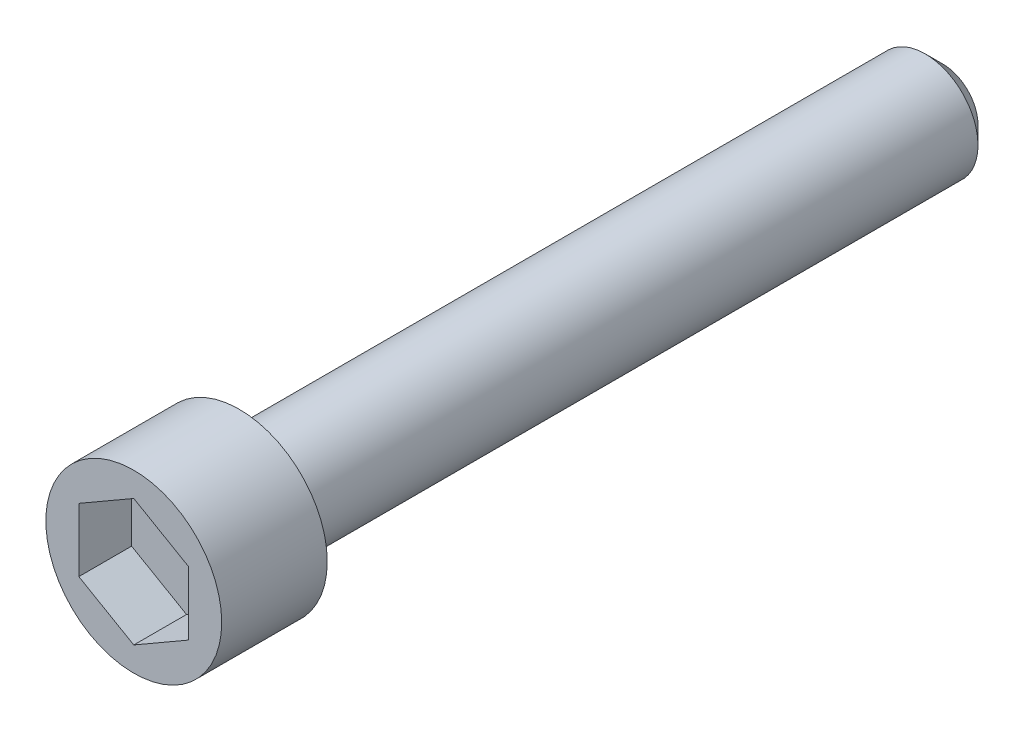
ISO-10303-21;
HEADER;
FILE_DESCRIPTION(('STEP AP214'),'2;1');
FILE_NAME('part.step','',(''),(''),'','','');
FILE_SCHEMA(('AUTOMOTIVE_DESIGN { 1 0 10303 214 1 1 1 1 }'));
ENDSEC;
DATA;
#1=APPLICATION_CONTEXT('core data for automotive mechanical design processes');
#2=APPLICATION_PROTOCOL_DEFINITION('international standard','automotive_design',2000,#1);
#3=PRODUCT_CONTEXT('',#1,'mechanical');
#4=PRODUCT('Part','Part','',(#3));
#5=PRODUCT_RELATED_PRODUCT_CATEGORY('part','',(#4));
#6=PRODUCT_DEFINITION_FORMATION('','',#4);
#7=PRODUCT_DEFINITION_CONTEXT('part definition',#1,'design');
#8=PRODUCT_DEFINITION('design','',#6,#7);
#9=PRODUCT_DEFINITION_SHAPE('','',#8);
#10=(LENGTH_UNIT() NAMED_UNIT(*) SI_UNIT(.MILLI.,.METRE.));
#11=(NAMED_UNIT(*) PLANE_ANGLE_UNIT() SI_UNIT($,.RADIAN.));
#12=(NAMED_UNIT(*) SI_UNIT($,.STERADIAN.) SOLID_ANGLE_UNIT());
#13=UNCERTAINTY_MEASURE_WITH_UNIT(LENGTH_MEASURE(1.E-05),#10,'distance_accuracy_value','');
#14=(GEOMETRIC_REPRESENTATION_CONTEXT(3) GLOBAL_UNCERTAINTY_ASSIGNED_CONTEXT((#13)) GLOBAL_UNIT_ASSIGNED_CONTEXT((#10,
#11,#12)) REPRESENTATION_CONTEXT('',''));
#15=CARTESIAN_POINT('',(0.,0.,0.));
#16=DIRECTION('',(0.,0.,1.));
#17=DIRECTION('',(1.,0.,0.));
#18=AXIS2_PLACEMENT_3D('',#15,#16,#17);
#19=CARTESIAN_POINT('',(0.,0.,20.));
#20=DIRECTION('',(0.,0.,-1.));
#21=DIRECTION('',(-1.,0.,0.));
#22=AXIS2_PLACEMENT_3D('',#19,#20,#21);
#23=CYLINDRICAL_SURFACE('',#22,1.5);
#24=CARTESIAN_POINT('',(0.,0.,0.500000000000004));
#25=DIRECTION('',(0.,0.,1.));
#26=DIRECTION('',(1.,0.,0.));
#27=AXIS2_PLACEMENT_3D('',#24,#25,#26);
#28=CIRCLE('',#27,1.5);
#29=CARTESIAN_POINT('',(1.5,0.,0.500000000000004));
#30=VERTEX_POINT('',#29);
#31=EDGE_CURVE('E44',#30,#30,#28,.T.);
#32=ORIENTED_EDGE('',*,*,#31,.T.);
#33=EDGE_LOOP('',(#32));
#34=FACE_BOUND('',#33,.T.);
#35=CARTESIAN_POINT('',(0.,0.,20.));
#36=DIRECTION('',(0.,0.,1.));
#37=DIRECTION('',(1.,0.,0.));
#38=AXIS2_PLACEMENT_3D('',#35,#36,#37);
#39=CIRCLE('',#38,1.5);
#40=CARTESIAN_POINT('',(1.5,0.,20.));
#41=VERTEX_POINT('',#40);
#42=EDGE_CURVE('E147',#41,#41,#39,.T.);
#43=ORIENTED_EDGE('',*,*,#42,.F.);
#44=EDGE_LOOP('',(#43));
#45=FACE_BOUND('',#44,.T.);
#46=ADVANCED_FACE('F36',(#34,#45),#23,.T.);
#47=CARTESIAN_POINT('',(0.,0.,0.));
#48=DIRECTION('',(0.,0.,1.));
#49=DIRECTION('',(1.,0.,0.));
#50=AXIS2_PLACEMENT_3D('',#47,#48,#49);
#51=PLANE('',#50);
#52=CARTESIAN_POINT('',(0.,0.,0.));
#53=DIRECTION('',(0.,0.,1.));
#54=DIRECTION('',(1.,0.,0.));
#55=AXIS2_PLACEMENT_3D('',#52,#53,#54);
#56=CIRCLE('',#55,0.999999999999997);
#57=CARTESIAN_POINT('',(0.999999999999997,0.,0.));
#58=VERTEX_POINT('',#57);
#59=EDGE_CURVE('E11',#58,#58,#56,.F.);
#60=ORIENTED_EDGE('',*,*,#59,.T.);
#61=EDGE_LOOP('',(#60));
#62=FACE_BOUND('',#61,.T.);
#63=ADVANCED_FACE('F165',(#62),#51,.F.);
#64=CARTESIAN_POINT('',(0.,0.,23.));
#65=DIRECTION('',(0.,0.,-1.));
#66=DIRECTION('',(-1.,0.,0.));
#67=AXIS2_PLACEMENT_3D('',#64,#65,#66);
#68=CYLINDRICAL_SURFACE('',#67,2.5);
#69=CARTESIAN_POINT('',(0.,0.,23.));
#70=DIRECTION('',(0.,0.,1.));
#71=DIRECTION('',(1.,0.,0.));
#72=AXIS2_PLACEMENT_3D('',#69,#70,#71);
#73=CIRCLE('',#72,2.5);
#74=CARTESIAN_POINT('',(2.5,0.,23.));
#75=VERTEX_POINT('',#74);
#76=EDGE_CURVE('E144',#75,#75,#73,.T.);
#77=ORIENTED_EDGE('',*,*,#76,.F.);
#78=EDGE_LOOP('',(#77));
#79=FACE_BOUND('',#78,.T.);
#80=CARTESIAN_POINT('',(0.,0.,20.));
#81=DIRECTION('',(0.,0.,1.));
#82=DIRECTION('',(1.,0.,0.));
#83=AXIS2_PLACEMENT_3D('',#80,#81,#82);
#84=CIRCLE('',#83,2.5);
#85=CARTESIAN_POINT('',(2.5,0.,20.));
#86=VERTEX_POINT('',#85);
#87=EDGE_CURVE('E138',#86,#86,#84,.T.);
#88=ORIENTED_EDGE('',*,*,#87,.T.);
#89=EDGE_LOOP('',(#88));
#90=FACE_BOUND('',#89,.T.);
#91=ADVANCED_FACE('F169',(#79,#90),#68,.T.);
#92=CARTESIAN_POINT('',(0.,0.,23.));
#93=DIRECTION('',(0.,0.,1.));
#94=DIRECTION('',(1.,0.,0.));
#95=AXIS2_PLACEMENT_3D('',#92,#93,#94);
#96=PLANE('',#95);
#97=DIRECTION('',(-0.866025403784442,0.499999999999995,0.));
#98=VECTOR('',#97,1.);
#99=CARTESIAN_POINT('',(1.56177486979958,0.901691141492407,23.));
#100=LINE('',#99,#98);
#101=CARTESIAN_POINT('',(1.56177486979958,0.901691141492407,23.));
#102=VERTEX_POINT('',#101);
#103=CARTESIAN_POINT('',(0.,1.80338228298478,23.));
#104=VERTEX_POINT('',#103);
#105=EDGE_CURVE('E51',#102,#104,#100,.T.);
#106=ORIENTED_EDGE('',*,*,#105,.F.);
#107=DIRECTION('',(0.,1.,0.));
#108=VECTOR('',#107,1.);
#109=CARTESIAN_POINT('',(1.5617748697996,-0.901691141492374,23.));
#110=LINE('',#109,#108);
#111=CARTESIAN_POINT('',(1.5617748697996,-0.901691141492374,23.));
#112=VERTEX_POINT('',#111);
#113=EDGE_CURVE('E134',#112,#102,#110,.T.);
#114=ORIENTED_EDGE('',*,*,#113,.F.);
#115=DIRECTION('',(0.866025403784435,0.500000000000007,0.));
#116=VECTOR('',#115,1.);
#117=CARTESIAN_POINT('',(0.,-1.80338228298478,23.));
#118=LINE('',#117,#116);
#119=CARTESIAN_POINT('',(0.,-1.80338228298478,23.));
#120=VERTEX_POINT('',#119);
#121=EDGE_CURVE('E132',#120,#112,#118,.T.);
#122=ORIENTED_EDGE('',*,*,#121,.F.);
#123=DIRECTION('',(0.866025403784441,-0.499999999999995,0.));
#124=VECTOR('',#123,1.);
#125=CARTESIAN_POINT('',(-1.56177486979959,-0.901691141492395,23.));
#126=LINE('',#125,#124);
#127=CARTESIAN_POINT('',(-1.56177486979959,-0.901691141492395,23.));
#128=VERTEX_POINT('',#127);
#129=EDGE_CURVE('E99',#128,#120,#126,.T.);
#130=ORIENTED_EDGE('',*,*,#129,.F.);
#131=DIRECTION('',(0.,-1.,0.));
#132=VECTOR('',#131,1.);
#133=CARTESIAN_POINT('',(-1.5617748697996,0.901691141492385,23.));
#134=LINE('',#133,#132);
#135=CARTESIAN_POINT('',(-1.5617748697996,0.901691141492385,23.));
#136=VERTEX_POINT('',#135);
#137=EDGE_CURVE('E128',#136,#128,#134,.T.);
#138=ORIENTED_EDGE('',*,*,#137,.F.);
#139=DIRECTION('',(-0.866025403784438,-0.500000000000001,0.));
#140=VECTOR('',#139,1.);
#141=CARTESIAN_POINT('',(0.,1.80338228298478,23.));
#142=LINE('',#141,#140);
#143=EDGE_CURVE('E125',#104,#136,#142,.T.);
#144=ORIENTED_EDGE('',*,*,#143,.F.);
#145=EDGE_LOOP('',(#106,#114,#122,#130,#138,#144));
#146=FACE_BOUND('',#145,.T.);
#147=ORIENTED_EDGE('',*,*,#76,.T.);
#148=EDGE_LOOP('',(#147));
#149=FACE_BOUND('',#148,.T.);
#150=ADVANCED_FACE('F175',(#146,#149),#96,.T.);
#151=CARTESIAN_POINT('',(0.,0.,20.));
#152=DIRECTION('',(0.,0.,1.));
#153=DIRECTION('',(1.,0.,0.));
#154=AXIS2_PLACEMENT_3D('',#151,#152,#153);
#155=PLANE('',#154);
#156=ORIENTED_EDGE('',*,*,#42,.T.);
#157=EDGE_LOOP('',(#156));
#158=FACE_BOUND('',#157,.T.);
#159=ORIENTED_EDGE('',*,*,#87,.F.);
#160=EDGE_LOOP('',(#159));
#161=FACE_BOUND('',#160,.T.);
#162=ADVANCED_FACE('F177',(#158,#161),#155,.F.);
#163=CARTESIAN_POINT('',(1.56177486979958,0.901691141492407,21.5));
#164=DIRECTION('',(0.499999999999995,0.866025403784441,0.));
#165=DIRECTION('',(-0.866025403784442,0.499999999999995,0.));
#166=AXIS2_PLACEMENT_3D('',#163,#164,#165);
#167=PLANE('',#166);
#168=ORIENTED_EDGE('',*,*,#105,.T.);
#169=DIRECTION('',(0.,0.,1.));
#170=VECTOR('',#169,1.);
#171=CARTESIAN_POINT('',(0.,1.80338228298478,21.5));
#172=LINE('',#171,#170);
#173=CARTESIAN_POINT('',(0.,1.80338228298478,21.5));
#174=VERTEX_POINT('',#173);
#175=EDGE_CURVE('E81',#174,#104,#172,.T.);
#176=ORIENTED_EDGE('',*,*,#175,.F.);
#177=DIRECTION('',(-0.866025403784442,0.499999999999995,0.));
#178=VECTOR('',#177,1.);
#179=CARTESIAN_POINT('',(1.56177486979958,0.901691141492407,21.5));
#180=LINE('',#179,#178);
#181=CARTESIAN_POINT('',(1.56177486979958,0.901691141492407,21.5));
#182=VERTEX_POINT('',#181);
#183=EDGE_CURVE('E136',#182,#174,#180,.T.);
#184=ORIENTED_EDGE('',*,*,#183,.F.);
#185=DIRECTION('',(0.,0.,1.));
#186=VECTOR('',#185,1.);
#187=CARTESIAN_POINT('',(1.56177486979958,0.901691141492407,21.5));
#188=LINE('',#187,#186);
#189=EDGE_CURVE('E59',#182,#102,#188,.T.);
#190=ORIENTED_EDGE('',*,*,#189,.T.);
#191=EDGE_LOOP('',(#168,#176,#184,#190));
#192=FACE_BOUND('',#191,.T.);
#193=ADVANCED_FACE('F180',(#192),#167,.F.);
#194=CARTESIAN_POINT('',(1.5617748697996,-0.901691141492374,21.5));
#195=DIRECTION('',(1.,0.,0.));
#196=DIRECTION('',(0.,1.,0.));
#197=AXIS2_PLACEMENT_3D('',#194,#195,#196);
#198=PLANE('',#197);
#199=ORIENTED_EDGE('',*,*,#113,.T.);
#200=ORIENTED_EDGE('',*,*,#189,.F.);
#201=DIRECTION('',(0.,1.,0.));
#202=VECTOR('',#201,1.);
#203=CARTESIAN_POINT('',(1.5617748697996,-0.901691141492374,21.5));
#204=LINE('',#203,#202);
#205=CARTESIAN_POINT('',(1.5617748697996,-0.901691141492374,21.5));
#206=VERTEX_POINT('',#205);
#207=EDGE_CURVE('E111',#206,#182,#204,.T.);
#208=ORIENTED_EDGE('',*,*,#207,.F.);
#209=DIRECTION('',(0.,0.,1.));
#210=VECTOR('',#209,1.);
#211=CARTESIAN_POINT('',(1.5617748697996,-0.901691141492374,21.5));
#212=LINE('',#211,#210);
#213=EDGE_CURVE('E103',#206,#112,#212,.T.);
#214=ORIENTED_EDGE('',*,*,#213,.T.);
#215=EDGE_LOOP('',(#199,#200,#208,#214));
#216=FACE_BOUND('',#215,.T.);
#217=ADVANCED_FACE('F187',(#216),#198,.F.);
#218=CARTESIAN_POINT('',(0.,-1.80338228298478,21.5));
#219=DIRECTION('',(0.500000000000007,-0.866025403784435,0.));
#220=DIRECTION('',(0.866025403784434,0.500000000000007,0.));
#221=AXIS2_PLACEMENT_3D('',#218,#219,#220);
#222=PLANE('',#221);
#223=ORIENTED_EDGE('',*,*,#121,.T.);
#224=ORIENTED_EDGE('',*,*,#213,.F.);
#225=DIRECTION('',(0.866025403784435,0.500000000000007,0.));
#226=VECTOR('',#225,1.);
#227=CARTESIAN_POINT('',(0.,-1.80338228298478,21.5));
#228=LINE('',#227,#226);
#229=CARTESIAN_POINT('',(0.,-1.80338228298478,21.5));
#230=VERTEX_POINT('',#229);
#231=EDGE_CURVE('E107',#230,#206,#228,.T.);
#232=ORIENTED_EDGE('',*,*,#231,.F.);
#233=DIRECTION('',(0.,0.,1.));
#234=VECTOR('',#233,1.);
#235=CARTESIAN_POINT('',(0.,-1.80338228298478,21.5));
#236=LINE('',#235,#234);
#237=EDGE_CURVE('E92',#230,#120,#236,.T.);
#238=ORIENTED_EDGE('',*,*,#237,.T.);
#239=EDGE_LOOP('',(#223,#224,#232,#238));
#240=FACE_BOUND('',#239,.T.);
#241=ADVANCED_FACE('F108',(#240),#222,.F.);
#242=CARTESIAN_POINT('',(-1.56177486979959,-0.901691141492395,21.5));
#243=DIRECTION('',(-0.499999999999995,-0.866025403784441,0.));
#244=DIRECTION('',(0.866025403784442,-0.499999999999995,0.));
#245=AXIS2_PLACEMENT_3D('',#242,#243,#244);
#246=PLANE('',#245);
#247=ORIENTED_EDGE('',*,*,#129,.T.);
#248=ORIENTED_EDGE('',*,*,#237,.F.);
#249=DIRECTION('',(0.866025403784441,-0.499999999999995,0.));
#250=VECTOR('',#249,1.);
#251=CARTESIAN_POINT('',(-1.56177486979959,-0.901691141492395,21.5));
#252=LINE('',#251,#250);
#253=CARTESIAN_POINT('',(-1.56177486979959,-0.901691141492395,21.5));
#254=VERTEX_POINT('',#253);
#255=EDGE_CURVE('E96',#254,#230,#252,.T.);
#256=ORIENTED_EDGE('',*,*,#255,.F.);
#257=DIRECTION('',(0.,0.,1.));
#258=VECTOR('',#257,1.);
#259=CARTESIAN_POINT('',(-1.56177486979959,-0.901691141492395,21.5));
#260=LINE('',#259,#258);
#261=EDGE_CURVE('E104',#254,#128,#260,.T.);
#262=ORIENTED_EDGE('',*,*,#261,.T.);
#263=EDGE_LOOP('',(#247,#248,#256,#262));
#264=FACE_BOUND('',#263,.T.);
#265=ADVANCED_FACE('F94',(#264),#246,.F.);
#266=CARTESIAN_POINT('',(-1.5617748697996,0.901691141492385,21.5));
#267=DIRECTION('',(-1.,0.,0.));
#268=DIRECTION('',(0.,-1.,0.));
#269=AXIS2_PLACEMENT_3D('',#266,#267,#268);
#270=PLANE('',#269);
#271=ORIENTED_EDGE('',*,*,#137,.T.);
#272=ORIENTED_EDGE('',*,*,#261,.F.);
#273=DIRECTION('',(0.,-1.,0.));
#274=VECTOR('',#273,1.);
#275=CARTESIAN_POINT('',(-1.5617748697996,0.901691141492385,21.5));
#276=LINE('',#275,#274);
#277=CARTESIAN_POINT('',(-1.5617748697996,0.901691141492385,21.5));
#278=VERTEX_POINT('',#277);
#279=EDGE_CURVE('E117',#278,#254,#276,.T.);
#280=ORIENTED_EDGE('',*,*,#279,.F.);
#281=DIRECTION('',(0.,0.,1.));
#282=VECTOR('',#281,1.);
#283=CARTESIAN_POINT('',(-1.5617748697996,0.901691141492385,21.5));
#284=LINE('',#283,#282);
#285=EDGE_CURVE('E141',#278,#136,#284,.T.);
#286=ORIENTED_EDGE('',*,*,#285,.T.);
#287=EDGE_LOOP('',(#271,#272,#280,#286));
#288=FACE_BOUND('',#287,.T.);
#289=ADVANCED_FACE('F190',(#288),#270,.F.);
#290=CARTESIAN_POINT('',(0.,1.80338228298478,21.5));
#291=DIRECTION('',(-0.500000000000001,0.866025403784438,0.));
#292=DIRECTION('',(-0.866025403784438,-0.500000000000001,0.));
#293=AXIS2_PLACEMENT_3D('',#290,#291,#292);
#294=PLANE('',#293);
#295=ORIENTED_EDGE('',*,*,#143,.T.);
#296=ORIENTED_EDGE('',*,*,#285,.F.);
#297=DIRECTION('',(-0.866025403784438,-0.500000000000001,0.));
#298=VECTOR('',#297,1.);
#299=CARTESIAN_POINT('',(0.,1.80338228298478,21.5));
#300=LINE('',#299,#298);
#301=EDGE_CURVE('E119',#174,#278,#300,.T.);
#302=ORIENTED_EDGE('',*,*,#301,.F.);
#303=ORIENTED_EDGE('',*,*,#175,.T.);
#304=EDGE_LOOP('',(#295,#296,#302,#303));
#305=FACE_BOUND('',#304,.T.);
#306=ADVANCED_FACE('F161',(#305),#294,.F.);
#307=CARTESIAN_POINT('',(0.,0.,21.5));
#308=DIRECTION('',(0.,0.,1.));
#309=DIRECTION('',(1.,0.,0.));
#310=AXIS2_PLACEMENT_3D('',#307,#308,#309);
#311=PLANE('',#310);
#312=ORIENTED_EDGE('',*,*,#183,.T.);
#313=ORIENTED_EDGE('',*,*,#301,.T.);
#314=ORIENTED_EDGE('',*,*,#279,.T.);
#315=ORIENTED_EDGE('',*,*,#255,.T.);
#316=ORIENTED_EDGE('',*,*,#231,.T.);
#317=ORIENTED_EDGE('',*,*,#207,.T.);
#318=EDGE_LOOP('',(#312,#313,#314,#315,#316,#317));
#319=FACE_BOUND('',#318,.T.);
#320=ADVANCED_FACE('F114',(#319),#311,.T.);
#321=CARTESIAN_POINT('',(0.,0.,0.500000000000004));
#322=DIRECTION('',(0.,0.,1.));
#323=DIRECTION('',(1.,0.,0.));
#324=AXIS2_PLACEMENT_3D('',#321,#322,#323);
#325=CONICAL_SURFACE('',#324,1.5,0.785398163397448);
#326=ORIENTED_EDGE('',*,*,#59,.F.);
#327=EDGE_LOOP('',(#326));
#328=FACE_BOUND('',#327,.T.);
#329=ORIENTED_EDGE('',*,*,#31,.F.);
#330=EDGE_LOOP('',(#329));
#331=FACE_BOUND('',#330,.T.);
#332=ADVANCED_FACE('F38',(#328,#331),#325,.T.);
#333=CLOSED_SHELL('',(#46,#63,#91,#150,#162,#193,#217,#241,#265,#289,#306,#320,#332));
#334=MANIFOLD_SOLID_BREP('B2',#333);
#335=ADVANCED_BREP_SHAPE_REPRESENTATION('',(#18,#334),#14);
#336=SHAPE_DEFINITION_REPRESENTATION(#9,#335);
ENDSEC;
END-ISO-10303-21;
